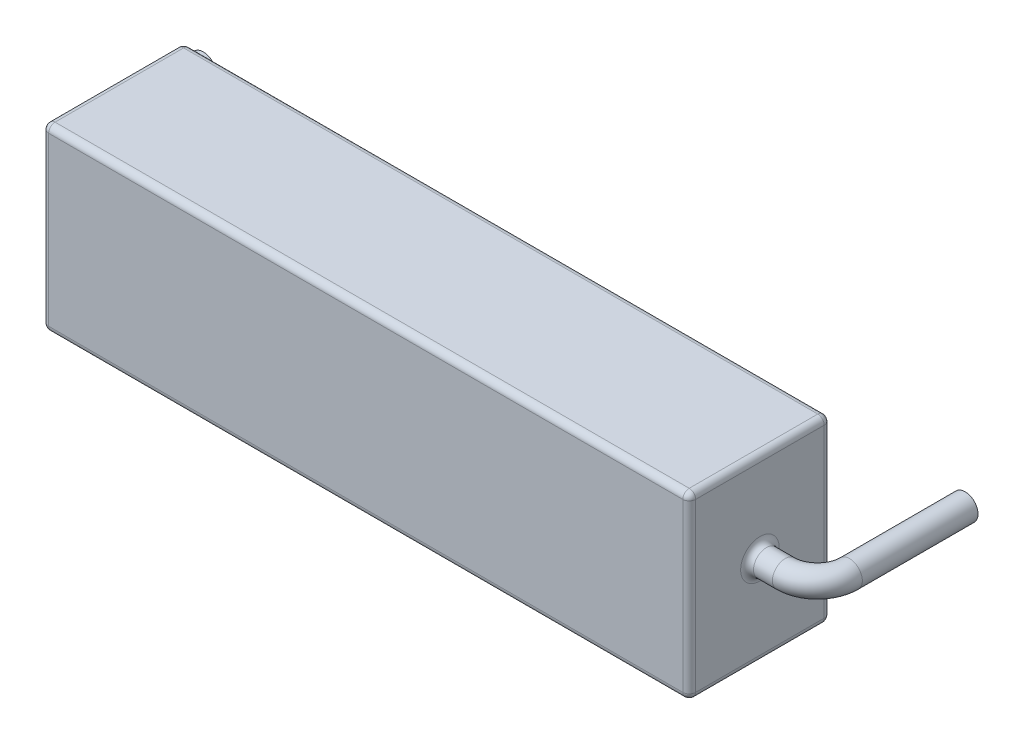
ISO-10303-21;
HEADER;
FILE_DESCRIPTION(('STEP AP214'),'2;1');
FILE_NAME('part.step','',(''),(''),'','','');
FILE_SCHEMA(('AUTOMOTIVE_DESIGN { 1 0 10303 214 1 1 1 1 }'));
ENDSEC;
DATA;
#1=APPLICATION_CONTEXT('core data for automotive mechanical design processes');
#2=APPLICATION_PROTOCOL_DEFINITION('international standard','automotive_design',2000,#1);
#3=PRODUCT_CONTEXT('',#1,'mechanical');
#4=PRODUCT('Part','Part','',(#3));
#5=PRODUCT_RELATED_PRODUCT_CATEGORY('part','',(#4));
#6=PRODUCT_DEFINITION_FORMATION('','',#4);
#7=PRODUCT_DEFINITION_CONTEXT('part definition',#1,'design');
#8=PRODUCT_DEFINITION('design','',#6,#7);
#9=PRODUCT_DEFINITION_SHAPE('','',#8);
#10=(LENGTH_UNIT() NAMED_UNIT(*) SI_UNIT(.MILLI.,.METRE.));
#11=(NAMED_UNIT(*) PLANE_ANGLE_UNIT() SI_UNIT($,.RADIAN.));
#12=(NAMED_UNIT(*) SI_UNIT($,.STERADIAN.) SOLID_ANGLE_UNIT());
#13=UNCERTAINTY_MEASURE_WITH_UNIT(LENGTH_MEASURE(1.E-05),#10,'distance_accuracy_value','');
#14=(GEOMETRIC_REPRESENTATION_CONTEXT(3) GLOBAL_UNCERTAINTY_ASSIGNED_CONTEXT((#13)) GLOBAL_UNIT_ASSIGNED_CONTEXT((#10,
#11,#12)) REPRESENTATION_CONTEXT('',''));
#15=CARTESIAN_POINT('',(0.,0.,0.));
#16=DIRECTION('',(0.,0.,1.));
#17=DIRECTION('',(1.,0.,0.));
#18=AXIS2_PLACEMENT_3D('',#15,#16,#17);
#19=CARTESIAN_POINT('',(0.,0.,3.3));
#20=DIRECTION('',(1.,0.,0.));
#21=DIRECTION('',(0.,0.,-1.));
#22=AXIS2_PLACEMENT_3D('',#19,#20,#21);
#23=PLANE('',#22);
#24=CARTESIAN_POINT('',(0.,2.1,1.65));
#25=DIRECTION('',(1.,0.,0.));
#26=DIRECTION('',(0.,0.,-1.));
#27=AXIS2_PLACEMENT_3D('',#24,#25,#26);
#28=CIRCLE('',#27,0.45);
#29=CARTESIAN_POINT('',(0.,2.1,1.2));
#30=VERTEX_POINT('',#29);
#31=EDGE_CURVE('E198',#30,#30,#28,.T.);
#32=ORIENTED_EDGE('',*,*,#31,.T.);
#33=EDGE_LOOP('',(#32));
#34=FACE_BOUND('',#33,.T.);
#35=DIRECTION('',(0.,0.,-1.));
#36=VECTOR('',#35,1.);
#37=CARTESIAN_POINT('',(0.,4.05,3.3));
#38=LINE('',#37,#36);
#39=CARTESIAN_POINT('',(0.,4.05,3.15));
#40=VERTEX_POINT('',#39);
#41=CARTESIAN_POINT('',(0.,4.05,0.15));
#42=VERTEX_POINT('',#41);
#43=EDGE_CURVE('E193',#40,#42,#38,.T.);
#44=ORIENTED_EDGE('',*,*,#43,.T.);
#45=DIRECTION('',(0.,-1.,0.));
#46=VECTOR('',#45,1.);
#47=CARTESIAN_POINT('',(0.,0.,0.15));
#48=LINE('',#47,#46);
#49=CARTESIAN_POINT('',(0.,0.15,0.15));
#50=VERTEX_POINT('',#49);
#51=EDGE_CURVE('E196',#42,#50,#48,.T.);
#52=ORIENTED_EDGE('',*,*,#51,.T.);
#53=DIRECTION('',(0.,0.,-1.));
#54=VECTOR('',#53,1.);
#55=CARTESIAN_POINT('',(0.,0.15,3.3));
#56=LINE('',#55,#54);
#57=CARTESIAN_POINT('',(0.,0.15,3.15));
#58=VERTEX_POINT('',#57);
#59=EDGE_CURVE('E191',#50,#58,#56,.F.);
#60=ORIENTED_EDGE('',*,*,#59,.T.);
#61=DIRECTION('',(0.,-1.,0.));
#62=VECTOR('',#61,1.);
#63=CARTESIAN_POINT('',(0.,0.,3.15));
#64=LINE('',#63,#62);
#65=EDGE_CURVE('E189',#58,#40,#64,.F.);
#66=ORIENTED_EDGE('',*,*,#65,.T.);
#67=EDGE_LOOP('',(#44,#52,#60,#66));
#68=FACE_BOUND('',#67,.T.);
#69=ADVANCED_FACE('F33',(#34,#68),#23,.F.);
#70=CARTESIAN_POINT('',(0.,0.,3.3));
#71=DIRECTION('',(0.,1.,0.));
#72=DIRECTION('',(0.,0.,1.));
#73=AXIS2_PLACEMENT_3D('',#70,#71,#72);
#74=PLANE('',#73);
#75=DIRECTION('',(0.,0.,-1.));
#76=VECTOR('',#75,1.);
#77=CARTESIAN_POINT('',(0.15,0.,3.3));
#78=LINE('',#77,#76);
#79=CARTESIAN_POINT('',(0.15,0.,3.15));
#80=VERTEX_POINT('',#79);
#81=CARTESIAN_POINT('',(0.15,0.,0.15));
#82=VERTEX_POINT('',#81);
#83=EDGE_CURVE('E172',#80,#82,#78,.T.);
#84=ORIENTED_EDGE('',*,*,#83,.T.);
#85=DIRECTION('',(1.,0.,0.));
#86=VECTOR('',#85,1.);
#87=CARTESIAN_POINT('',(15.1,0.,0.15));
#88=LINE('',#87,#86);
#89=CARTESIAN_POINT('',(14.95,0.,0.15));
#90=VERTEX_POINT('',#89);
#91=EDGE_CURVE('E177',#82,#90,#88,.T.);
#92=ORIENTED_EDGE('',*,*,#91,.T.);
#93=DIRECTION('',(0.,0.,-1.));
#94=VECTOR('',#93,1.);
#95=CARTESIAN_POINT('',(14.95,0.,3.3));
#96=LINE('',#95,#94);
#97=CARTESIAN_POINT('',(14.95,0.,3.15));
#98=VERTEX_POINT('',#97);
#99=EDGE_CURVE('E174',#90,#98,#96,.F.);
#100=ORIENTED_EDGE('',*,*,#99,.T.);
#101=DIRECTION('',(1.,0.,0.));
#102=VECTOR('',#101,1.);
#103=CARTESIAN_POINT('',(0.,0.,3.15));
#104=LINE('',#103,#102);
#105=EDGE_CURVE('E170',#98,#80,#104,.F.);
#106=ORIENTED_EDGE('',*,*,#105,.T.);
#107=EDGE_LOOP('',(#84,#92,#100,#106));
#108=FACE_BOUND('',#107,.T.);
#109=ADVANCED_FACE('F310',(#108),#74,.F.);
#110=CARTESIAN_POINT('',(15.1,0.,3.3));
#111=DIRECTION('',(-1.,0.,0.));
#112=DIRECTION('',(0.,0.,1.));
#113=AXIS2_PLACEMENT_3D('',#110,#111,#112);
#114=PLANE('',#113);
#115=CARTESIAN_POINT('',(15.1,2.1,1.65));
#116=DIRECTION('',(-1.,0.,0.));
#117=DIRECTION('',(0.,0.,1.));
#118=AXIS2_PLACEMENT_3D('',#115,#116,#117);
#119=CIRCLE('',#118,0.45);
#120=CARTESIAN_POINT('',(15.1,2.1,2.1));
#121=VERTEX_POINT('',#120);
#122=EDGE_CURVE('E167',#121,#121,#119,.T.);
#123=ORIENTED_EDGE('',*,*,#122,.T.);
#124=EDGE_LOOP('',(#123));
#125=FACE_BOUND('',#124,.T.);
#126=DIRECTION('',(0.,0.,-1.));
#127=VECTOR('',#126,1.);
#128=CARTESIAN_POINT('',(15.1,0.15,3.3));
#129=LINE('',#128,#127);
#130=CARTESIAN_POINT('',(15.1,0.15,3.15));
#131=VERTEX_POINT('',#130);
#132=CARTESIAN_POINT('',(15.1,0.15,0.15));
#133=VERTEX_POINT('',#132);
#134=EDGE_CURVE('E132',#131,#133,#129,.T.);
#135=ORIENTED_EDGE('',*,*,#134,.T.);
#136=DIRECTION('',(0.,1.,0.));
#137=VECTOR('',#136,1.);
#138=CARTESIAN_POINT('',(15.1,4.2,0.15));
#139=LINE('',#138,#137);
#140=CARTESIAN_POINT('',(15.1,4.05,0.15));
#141=VERTEX_POINT('',#140);
#142=EDGE_CURVE('E128',#133,#141,#139,.T.);
#143=ORIENTED_EDGE('',*,*,#142,.T.);
#144=DIRECTION('',(0.,0.,-1.));
#145=VECTOR('',#144,1.);
#146=CARTESIAN_POINT('',(15.1,4.05,3.3));
#147=LINE('',#146,#145);
#148=CARTESIAN_POINT('',(15.1,4.05,3.15));
#149=VERTEX_POINT('',#148);
#150=EDGE_CURVE('E120',#141,#149,#147,.F.);
#151=ORIENTED_EDGE('',*,*,#150,.T.);
#152=DIRECTION('',(0.,1.,0.));
#153=VECTOR('',#152,1.);
#154=CARTESIAN_POINT('',(15.1,0.,3.15));
#155=LINE('',#154,#153);
#156=EDGE_CURVE('E125',#149,#131,#155,.F.);
#157=ORIENTED_EDGE('',*,*,#156,.T.);
#158=EDGE_LOOP('',(#135,#143,#151,#157));
#159=FACE_BOUND('',#158,.T.);
#160=ADVANCED_FACE('F123',(#125,#159),#114,.F.);
#161=CARTESIAN_POINT('',(0.,4.2,3.3));
#162=DIRECTION('',(0.,-1.,0.));
#163=DIRECTION('',(0.,0.,-1.));
#164=AXIS2_PLACEMENT_3D('',#161,#162,#163);
#165=PLANE('',#164);
#166=DIRECTION('',(0.,0.,-1.));
#167=VECTOR('',#166,1.);
#168=CARTESIAN_POINT('',(14.95,4.2,3.3));
#169=LINE('',#168,#167);
#170=CARTESIAN_POINT('',(14.95,4.2,3.15));
#171=VERTEX_POINT('',#170);
#172=CARTESIAN_POINT('',(14.95,4.2,0.15));
#173=VERTEX_POINT('',#172);
#174=EDGE_CURVE('E140',#171,#173,#169,.T.);
#175=ORIENTED_EDGE('',*,*,#174,.T.);
#176=DIRECTION('',(-1.,0.,0.));
#177=VECTOR('',#176,1.);
#178=CARTESIAN_POINT('',(0.,4.2,0.15));
#179=LINE('',#178,#177);
#180=CARTESIAN_POINT('',(0.15,4.2,0.15));
#181=VERTEX_POINT('',#180);
#182=EDGE_CURVE('E184',#173,#181,#179,.T.);
#183=ORIENTED_EDGE('',*,*,#182,.T.);
#184=DIRECTION('',(0.,0.,-1.));
#185=VECTOR('',#184,1.);
#186=CARTESIAN_POINT('',(0.15,4.2,3.3));
#187=LINE('',#186,#185);
#188=CARTESIAN_POINT('',(0.15,4.2,3.15));
#189=VERTEX_POINT('',#188);
#190=EDGE_CURVE('E181',#181,#189,#187,.F.);
#191=ORIENTED_EDGE('',*,*,#190,.T.);
#192=DIRECTION('',(-1.,0.,0.));
#193=VECTOR('',#192,1.);
#194=CARTESIAN_POINT('',(0.,4.2,3.15));
#195=LINE('',#194,#193);
#196=EDGE_CURVE('E179',#189,#171,#195,.F.);
#197=ORIENTED_EDGE('',*,*,#196,.T.);
#198=EDGE_LOOP('',(#175,#183,#191,#197));
#199=FACE_BOUND('',#198,.T.);
#200=ADVANCED_FACE('F405',(#199),#165,.F.);
#201=CARTESIAN_POINT('',(0.,0.,3.3));
#202=DIRECTION('',(0.,0.,-1.));
#203=DIRECTION('',(-1.,0.,0.));
#204=AXIS2_PLACEMENT_3D('',#201,#202,#203);
#205=PLANE('',#204);
#206=DIRECTION('',(0.,1.,0.));
#207=VECTOR('',#206,1.);
#208=CARTESIAN_POINT('',(14.95,0.,3.3));
#209=LINE('',#208,#207);
#210=CARTESIAN_POINT('',(14.95,0.15,3.3));
#211=VERTEX_POINT('',#210);
#212=CARTESIAN_POINT('',(14.95,4.05,3.3));
#213=VERTEX_POINT('',#212);
#214=EDGE_CURVE('E42',#211,#213,#209,.T.);
#215=ORIENTED_EDGE('',*,*,#214,.T.);
#216=DIRECTION('',(-1.,0.,0.));
#217=VECTOR('',#216,1.);
#218=CARTESIAN_POINT('',(0.,4.05,3.3));
#219=LINE('',#218,#217);
#220=CARTESIAN_POINT('',(0.15,4.05,3.3));
#221=VERTEX_POINT('',#220);
#222=EDGE_CURVE('E11',#213,#221,#219,.T.);
#223=ORIENTED_EDGE('',*,*,#222,.T.);
#224=DIRECTION('',(0.,-1.,0.));
#225=VECTOR('',#224,1.);
#226=CARTESIAN_POINT('',(0.15,0.,3.3));
#227=LINE('',#226,#225);
#228=CARTESIAN_POINT('',(0.15,0.15,3.3));
#229=VERTEX_POINT('',#228);
#230=EDGE_CURVE('E213',#221,#229,#227,.T.);
#231=ORIENTED_EDGE('',*,*,#230,.T.);
#232=DIRECTION('',(1.,0.,0.));
#233=VECTOR('',#232,1.);
#234=CARTESIAN_POINT('',(0.,0.15,3.3));
#235=LINE('',#234,#233);
#236=EDGE_CURVE('E53',#229,#211,#235,.T.);
#237=ORIENTED_EDGE('',*,*,#236,.T.);
#238=EDGE_LOOP('',(#215,#223,#231,#237));
#239=FACE_BOUND('',#238,.T.);
#240=ADVANCED_FACE('F409',(#239),#205,.F.);
#241=CARTESIAN_POINT('',(0.,0.,0.));
#242=DIRECTION('',(0.,0.,-1.));
#243=DIRECTION('',(-1.,0.,0.));
#244=AXIS2_PLACEMENT_3D('',#241,#242,#243);
#245=PLANE('',#244);
#246=DIRECTION('',(0.,1.,0.));
#247=VECTOR('',#246,1.);
#248=CARTESIAN_POINT('',(14.95,0.,0.));
#249=LINE('',#248,#247);
#250=CARTESIAN_POINT('',(14.95,4.05,0.));
#251=VERTEX_POINT('',#250);
#252=CARTESIAN_POINT('',(14.95,0.15,0.));
#253=VERTEX_POINT('',#252);
#254=EDGE_CURVE('E208',#251,#253,#249,.F.);
#255=ORIENTED_EDGE('',*,*,#254,.T.);
#256=DIRECTION('',(1.,0.,0.));
#257=VECTOR('',#256,1.);
#258=CARTESIAN_POINT('',(0.,0.15,0.));
#259=LINE('',#258,#257);
#260=CARTESIAN_POINT('',(0.15,0.15,0.));
#261=VERTEX_POINT('',#260);
#262=EDGE_CURVE('E210',#253,#261,#259,.F.);
#263=ORIENTED_EDGE('',*,*,#262,.T.);
#264=DIRECTION('',(0.,-1.,0.));
#265=VECTOR('',#264,1.);
#266=CARTESIAN_POINT('',(0.15,4.2,0.));
#267=LINE('',#266,#265);
#268=CARTESIAN_POINT('',(0.15,4.05,0.));
#269=VERTEX_POINT('',#268);
#270=EDGE_CURVE('E204',#261,#269,#267,.F.);
#271=ORIENTED_EDGE('',*,*,#270,.T.);
#272=DIRECTION('',(-1.,0.,0.));
#273=VECTOR('',#272,1.);
#274=CARTESIAN_POINT('',(15.1,4.05,0.));
#275=LINE('',#274,#273);
#276=EDGE_CURVE('E206',#269,#251,#275,.F.);
#277=ORIENTED_EDGE('',*,*,#276,.T.);
#278=EDGE_LOOP('',(#255,#263,#271,#277));
#279=FACE_BOUND('',#278,.T.);
#280=ADVANCED_FACE('F413',(#279),#245,.T.);
#281=CARTESIAN_POINT('',(16.44,2.1,-1.8));
#282=DIRECTION('',(0.,0.,-1.));
#283=DIRECTION('',(-1.,0.,0.));
#284=AXIS2_PLACEMENT_3D('',#281,#282,#283);
#285=PLANE('',#284);
#286=CARTESIAN_POINT('',(16.44,2.1,-1.8));
#287=DIRECTION('',(0.,0.,-1.));
#288=DIRECTION('',(-1.,0.,0.));
#289=AXIS2_PLACEMENT_3D('',#286,#287,#288);
#290=CIRCLE('',#289,0.3);
#291=CARTESIAN_POINT('',(16.14,2.1,-1.79999999999999));
#292=VERTEX_POINT('',#291);
#293=EDGE_CURVE('E158',#292,#292,#290,.T.);
#294=ORIENTED_EDGE('',*,*,#293,.T.);
#295=EDGE_LOOP('',(#294));
#296=FACE_BOUND('',#295,.T.);
#297=ADVANCED_FACE('F307',(#296),#285,.T.);
#298=CARTESIAN_POINT('',(16.44,2.1,0.899999999999998));
#299=DIRECTION('',(0.,0.,-1.));
#300=DIRECTION('',(-1.,0.,0.));
#301=AXIS2_PLACEMENT_3D('',#298,#299,#300);
#302=CYLINDRICAL_SURFACE('',#301,0.3);
#303=CARTESIAN_POINT('',(16.44,2.1,0.899999999999998));
#304=DIRECTION('',(0.,0.,-1.));
#305=DIRECTION('',(-1.,0.,0.));
#306=AXIS2_PLACEMENT_3D('',#303,#304,#305);
#307=CIRCLE('',#306,0.3);
#308=CARTESIAN_POINT('',(16.74,2.1,0.899999999999997));
#309=VERTEX_POINT('',#308);
#310=EDGE_CURVE('E161',#309,#309,#307,.T.);
#311=ORIENTED_EDGE('',*,*,#310,.T.);
#312=EDGE_LOOP('',(#311));
#313=FACE_BOUND('',#312,.T.);
#314=ORIENTED_EDGE('',*,*,#293,.F.);
#315=EDGE_LOOP('',(#314));
#316=FACE_BOUND('',#315,.T.);
#317=ADVANCED_FACE('F292',(#313,#316),#302,.T.);
#318=CARTESIAN_POINT('',(15.69,2.1,0.9));
#319=DIRECTION('',(0.,1.,0.));
#320=DIRECTION('',(0.,0.,1.));
#321=AXIS2_PLACEMENT_3D('',#318,#319,#320);
#322=TOROIDAL_SURFACE('',#321,0.750000000000001,0.3);
#323=CARTESIAN_POINT('',(15.69,2.1,1.65));
#324=DIRECTION('',(1.,0.,0.));
#325=DIRECTION('',(0.,0.,-1.));
#326=AXIS2_PLACEMENT_3D('',#323,#324,#325);
#327=CIRCLE('',#326,0.3);
#328=CARTESIAN_POINT('',(15.69,2.1,1.95));
#329=VERTEX_POINT('',#328);
#330=EDGE_CURVE('E287',#329,#329,#327,.T.);
#331=CARTESIAN_POINT('',(15.69,2.1,0.9));
#332=DIRECTION('',(0.,1.,0.));
#333=DIRECTION('',(0.,0.,1.));
#334=AXIS2_PLACEMENT_3D('',#331,#332,#333);
#335=CIRCLE('',#334,1.05);
#336=EDGE_CURVE('',#329,#309,#335,.T.);
#337=ORIENTED_EDGE('',*,*,#330,.T.);
#338=ORIENTED_EDGE('',*,*,#310,.F.);
#339=ORIENTED_EDGE('',*,*,#336,.T.);
#340=ORIENTED_EDGE('',*,*,#336,.F.);
#341=EDGE_LOOP('',(#337,#339,#338,#340));
#342=FACE_BOUND('',#341,.T.);
#343=ADVANCED_FACE('F295',(#342),#322,.T.);
#344=CARTESIAN_POINT('',(-0.589999999999995,2.1,1.65));
#345=DIRECTION('',(1.,0.,0.));
#346=DIRECTION('',(0.,0.,-1.));
#347=AXIS2_PLACEMENT_3D('',#344,#345,#346);
#348=CYLINDRICAL_SURFACE('',#347,0.3);
#349=CARTESIAN_POINT('',(15.25,2.1,1.65));
#350=DIRECTION('',(-1.,0.,0.));
#351=DIRECTION('',(0.,0.,1.));
#352=AXIS2_PLACEMENT_3D('',#349,#350,#351);
#353=CIRCLE('',#352,0.3);
#354=CARTESIAN_POINT('',(15.25,2.1,1.95));
#355=VERTEX_POINT('',#354);
#356=EDGE_CURVE('E186',#355,#355,#353,.F.);
#357=ORIENTED_EDGE('',*,*,#356,.T.);
#358=EDGE_LOOP('',(#357));
#359=FACE_BOUND('',#358,.T.);
#360=ORIENTED_EDGE('',*,*,#330,.F.);
#361=EDGE_LOOP('',(#360));
#362=FACE_BOUND('',#361,.T.);
#363=ADVANCED_FACE('F297',(#359,#362),#348,.T.);
#364=CARTESIAN_POINT('',(-0.15,2.1,1.65));
#365=DIRECTION('',(1.,0.,0.));
#366=DIRECTION('',(0.,0.,-1.));
#367=AXIS2_PLACEMENT_3D('',#364,#365,#366);
#368=CIRCLE('',#367,0.3);
#369=CARTESIAN_POINT('',(-0.15,2.1,1.35));
#370=VERTEX_POINT('',#369);
#371=EDGE_CURVE('E201',#370,#370,#368,.F.);
#372=ORIENTED_EDGE('',*,*,#371,.T.);
#373=EDGE_LOOP('',(#372));
#374=FACE_BOUND('',#373,.T.);
#375=CARTESIAN_POINT('',(-0.589999999999995,2.1,1.65));
#376=DIRECTION('',(1.,0.,0.));
#377=DIRECTION('',(0.,0.,-1.));
#378=AXIS2_PLACEMENT_3D('',#375,#376,#377);
#379=CIRCLE('',#378,0.3);
#380=CARTESIAN_POINT('',(-0.589999999999992,2.1,1.95));
#381=VERTEX_POINT('',#380);
#382=EDGE_CURVE('E282',#381,#381,#379,.T.);
#383=ORIENTED_EDGE('',*,*,#382,.T.);
#384=EDGE_LOOP('',(#383));
#385=FACE_BOUND('',#384,.T.);
#386=ADVANCED_FACE('F304',(#374,#385),#348,.T.);
#387=CARTESIAN_POINT('',(-0.590000000000001,2.1,0.9));
#388=DIRECTION('',(0.,1.,0.));
#389=DIRECTION('',(0.,0.,1.));
#390=AXIS2_PLACEMENT_3D('',#387,#388,#389);
#391=TOROIDAL_SURFACE('',#390,0.75,0.3);
#392=CARTESIAN_POINT('',(-1.34,2.1,0.899999999999995));
#393=DIRECTION('',(0.,0.,1.));
#394=DIRECTION('',(1.,0.,0.));
#395=AXIS2_PLACEMENT_3D('',#392,#393,#394);
#396=CIRCLE('',#395,0.3);
#397=CARTESIAN_POINT('',(-1.64,2.1,0.899999999999994));
#398=VERTEX_POINT('',#397);
#399=EDGE_CURVE('E277',#398,#398,#396,.T.);
#400=CARTESIAN_POINT('',(-0.590000000000001,2.1,0.9));
#401=DIRECTION('',(0.,1.,0.));
#402=DIRECTION('',(0.,0.,1.));
#403=AXIS2_PLACEMENT_3D('',#400,#401,#402);
#404=CIRCLE('',#403,1.05);
#405=EDGE_CURVE('',#398,#381,#404,.T.);
#406=ORIENTED_EDGE('',*,*,#399,.T.);
#407=ORIENTED_EDGE('',*,*,#382,.F.);
#408=ORIENTED_EDGE('',*,*,#405,.T.);
#409=ORIENTED_EDGE('',*,*,#405,.F.);
#410=EDGE_LOOP('',(#406,#408,#407,#409));
#411=FACE_BOUND('',#410,.T.);
#412=ADVANCED_FACE('F448',(#411),#391,.T.);
#413=CARTESIAN_POINT('',(-1.34,2.1,0.899999999999995));
#414=DIRECTION('',(0.,0.,-1.));
#415=DIRECTION('',(-1.,0.,0.));
#416=AXIS2_PLACEMENT_3D('',#413,#414,#415);
#417=CYLINDRICAL_SURFACE('',#416,0.3);
#418=ORIENTED_EDGE('',*,*,#399,.F.);
#419=EDGE_LOOP('',(#418));
#420=FACE_BOUND('',#419,.T.);
#421=CARTESIAN_POINT('',(-1.34,2.1,-1.8));
#422=DIRECTION('',(0.,0.,1.));
#423=DIRECTION('',(1.,0.,0.));
#424=AXIS2_PLACEMENT_3D('',#421,#422,#423);
#425=CIRCLE('',#424,0.3);
#426=CARTESIAN_POINT('',(-1.04,2.1,-1.8));
#427=VERTEX_POINT('',#426);
#428=EDGE_CURVE('E271',#427,#427,#425,.T.);
#429=ORIENTED_EDGE('',*,*,#428,.T.);
#430=EDGE_LOOP('',(#429));
#431=FACE_BOUND('',#430,.T.);
#432=ADVANCED_FACE('F453',(#420,#431),#417,.T.);
#433=CARTESIAN_POINT('',(-1.34,2.1,-1.8));
#434=DIRECTION('',(0.,0.,1.));
#435=DIRECTION('',(1.,0.,0.));
#436=AXIS2_PLACEMENT_3D('',#433,#434,#435);
#437=PLANE('',#436);
#438=ORIENTED_EDGE('',*,*,#428,.F.);
#439=EDGE_LOOP('',(#438));
#440=FACE_BOUND('',#439,.T.);
#441=ADVANCED_FACE('F392',(#440),#437,.F.);
#442=CARTESIAN_POINT('',(0.15,4.05,3.3));
#443=DIRECTION('',(0.,0.,-1.));
#444=DIRECTION('',(-1.,0.,0.));
#445=AXIS2_PLACEMENT_3D('',#442,#443,#444);
#446=CYLINDRICAL_SURFACE('',#445,0.15);
#447=CARTESIAN_POINT('',(0.15,4.05,3.15));
#448=DIRECTION('',(0.,0.,1.));
#449=DIRECTION('',(1.,0.,0.));
#450=AXIS2_PLACEMENT_3D('',#447,#448,#449);
#451=CIRCLE('',#450,0.15);
#452=EDGE_CURVE('E37',#189,#40,#451,.T.);
#453=ORIENTED_EDGE('',*,*,#452,.F.);
#454=ORIENTED_EDGE('',*,*,#190,.F.);
#455=CARTESIAN_POINT('',(0.15,4.05,0.15));
#456=DIRECTION('',(0.,0.,-1.));
#457=DIRECTION('',(-1.,0.,0.));
#458=AXIS2_PLACEMENT_3D('',#455,#456,#457);
#459=CIRCLE('',#458,0.15);
#460=EDGE_CURVE('E264',#42,#181,#459,.T.);
#461=ORIENTED_EDGE('',*,*,#460,.F.);
#462=ORIENTED_EDGE('',*,*,#43,.F.);
#463=EDGE_LOOP('',(#453,#454,#461,#462));
#464=FACE_BOUND('',#463,.T.);
#465=ADVANCED_FACE('F390',(#464),#446,.T.);
#466=CARTESIAN_POINT('',(0.15,4.05,3.15));
#467=DIRECTION('',(0.,0.,1.));
#468=DIRECTION('',(1.,0.,0.));
#469=AXIS2_PLACEMENT_3D('',#466,#467,#468);
#470=SPHERICAL_SURFACE('',#469,0.15);
#471=CARTESIAN_POINT('',(0.15,4.05,3.15));
#472=DIRECTION('',(-1.,0.,0.));
#473=DIRECTION('',(0.,0.,1.));
#474=AXIS2_PLACEMENT_3D('',#471,#472,#473);
#475=CIRCLE('',#474,0.15);
#476=EDGE_CURVE('E259',#189,#221,#475,.F.);
#477=ORIENTED_EDGE('',*,*,#476,.F.);
#478=ORIENTED_EDGE('',*,*,#452,.T.);
#479=CARTESIAN_POINT('',(0.15,4.05,3.15));
#480=DIRECTION('',(0.,1.,0.));
#481=DIRECTION('',(0.,0.,1.));
#482=AXIS2_PLACEMENT_3D('',#479,#480,#481);
#483=CIRCLE('',#482,0.15);
#484=EDGE_CURVE('E262',#221,#40,#483,.F.);
#485=ORIENTED_EDGE('',*,*,#484,.F.);
#486=EDGE_LOOP('',(#477,#478,#485));
#487=FACE_BOUND('',#486,.T.);
#488=ADVANCED_FACE('F387',(#487),#470,.T.);
#489=CARTESIAN_POINT('',(0.15,4.05,0.15));
#490=DIRECTION('',(0.,0.,1.));
#491=DIRECTION('',(1.,0.,0.));
#492=AXIS2_PLACEMENT_3D('',#489,#490,#491);
#493=SPHERICAL_SURFACE('',#492,0.15);
#494=CARTESIAN_POINT('',(0.15,4.05,0.15));
#495=DIRECTION('',(0.,1.,0.));
#496=DIRECTION('',(0.,0.,1.));
#497=AXIS2_PLACEMENT_3D('',#494,#495,#496);
#498=CIRCLE('',#497,0.15);
#499=EDGE_CURVE('E253',#42,#269,#498,.F.);
#500=ORIENTED_EDGE('',*,*,#499,.F.);
#501=ORIENTED_EDGE('',*,*,#460,.T.);
#502=CARTESIAN_POINT('',(0.15,4.05,0.15));
#503=DIRECTION('',(-1.,0.,0.));
#504=DIRECTION('',(0.,0.,1.));
#505=AXIS2_PLACEMENT_3D('',#502,#503,#504);
#506=CIRCLE('',#505,0.15);
#507=EDGE_CURVE('E256',#269,#181,#506,.F.);
#508=ORIENTED_EDGE('',*,*,#507,.F.);
#509=EDGE_LOOP('',(#500,#501,#508));
#510=FACE_BOUND('',#509,.T.);
#511=ADVANCED_FACE('F383',(#510),#493,.T.);
#512=CARTESIAN_POINT('',(0.15,0.,3.15));
#513=DIRECTION('',(0.,-1.,0.));
#514=DIRECTION('',(0.,0.,-1.));
#515=AXIS2_PLACEMENT_3D('',#512,#513,#514);
#516=CYLINDRICAL_SURFACE('',#515,0.15);
#517=ORIENTED_EDGE('',*,*,#484,.T.);
#518=ORIENTED_EDGE('',*,*,#65,.F.);
#519=CARTESIAN_POINT('',(0.15,0.15,3.15));
#520=DIRECTION('',(0.,-1.,0.));
#521=DIRECTION('',(0.,0.,-1.));
#522=AXIS2_PLACEMENT_3D('',#519,#520,#521);
#523=CIRCLE('',#522,0.15);
#524=EDGE_CURVE('E247',#229,#58,#523,.T.);
#525=ORIENTED_EDGE('',*,*,#524,.F.);
#526=ORIENTED_EDGE('',*,*,#230,.F.);
#527=EDGE_LOOP('',(#517,#518,#525,#526));
#528=FACE_BOUND('',#527,.T.);
#529=ADVANCED_FACE('F379',(#528),#516,.T.);
#530=CARTESIAN_POINT('',(0.,4.05,3.15));
#531=DIRECTION('',(-1.,0.,0.));
#532=DIRECTION('',(0.,0.,1.));
#533=AXIS2_PLACEMENT_3D('',#530,#531,#532);
#534=CYLINDRICAL_SURFACE('',#533,0.15);
#535=ORIENTED_EDGE('',*,*,#476,.T.);
#536=ORIENTED_EDGE('',*,*,#222,.F.);
#537=CARTESIAN_POINT('',(14.95,4.05,3.15));
#538=DIRECTION('',(1.,0.,0.));
#539=DIRECTION('',(0.,0.,-1.));
#540=AXIS2_PLACEMENT_3D('',#537,#538,#539);
#541=CIRCLE('',#540,0.15);
#542=EDGE_CURVE('E144',#171,#213,#541,.T.);
#543=ORIENTED_EDGE('',*,*,#542,.F.);
#544=ORIENTED_EDGE('',*,*,#196,.F.);
#545=EDGE_LOOP('',(#535,#536,#543,#544));
#546=FACE_BOUND('',#545,.T.);
#547=ADVANCED_FACE('F376',(#546),#534,.T.);
#548=CARTESIAN_POINT('',(14.95,4.05,3.3));
#549=DIRECTION('',(0.,0.,-1.));
#550=DIRECTION('',(-1.,0.,0.));
#551=AXIS2_PLACEMENT_3D('',#548,#549,#550);
#552=CYLINDRICAL_SURFACE('',#551,0.15);
#553=CARTESIAN_POINT('',(14.95,4.05,0.15));
#554=DIRECTION('',(0.,0.,-1.));
#555=DIRECTION('',(-1.,0.,0.));
#556=AXIS2_PLACEMENT_3D('',#553,#554,#555);
#557=CIRCLE('',#556,0.15);
#558=EDGE_CURVE('E145',#173,#141,#557,.T.);
#559=ORIENTED_EDGE('',*,*,#558,.F.);
#560=ORIENTED_EDGE('',*,*,#174,.F.);
#561=CARTESIAN_POINT('',(14.95,4.05,3.15));
#562=DIRECTION('',(0.,0.,1.));
#563=DIRECTION('',(1.,0.,0.));
#564=AXIS2_PLACEMENT_3D('',#561,#562,#563);
#565=CIRCLE('',#564,0.15);
#566=EDGE_CURVE('E136',#149,#171,#565,.T.);
#567=ORIENTED_EDGE('',*,*,#566,.F.);
#568=ORIENTED_EDGE('',*,*,#150,.F.);
#569=EDGE_LOOP('',(#559,#560,#567,#568));
#570=FACE_BOUND('',#569,.T.);
#571=ADVANCED_FACE('F138',(#570),#552,.T.);
#572=CARTESIAN_POINT('',(0.,4.05,0.15));
#573=DIRECTION('',(1.,0.,0.));
#574=DIRECTION('',(0.,0.,-1.));
#575=AXIS2_PLACEMENT_3D('',#572,#573,#574);
#576=CYLINDRICAL_SURFACE('',#575,0.15);
#577=ORIENTED_EDGE('',*,*,#507,.T.);
#578=ORIENTED_EDGE('',*,*,#182,.F.);
#579=CARTESIAN_POINT('',(14.95,4.05,0.15));
#580=DIRECTION('',(1.,0.,0.));
#581=DIRECTION('',(0.,0.,-1.));
#582=AXIS2_PLACEMENT_3D('',#579,#580,#581);
#583=CIRCLE('',#582,0.15);
#584=EDGE_CURVE('E243',#251,#173,#583,.T.);
#585=ORIENTED_EDGE('',*,*,#584,.F.);
#586=ORIENTED_EDGE('',*,*,#276,.F.);
#587=EDGE_LOOP('',(#577,#578,#585,#586));
#588=FACE_BOUND('',#587,.T.);
#589=ADVANCED_FACE('F369',(#588),#576,.T.);
#590=CARTESIAN_POINT('',(0.15,0.,0.15));
#591=DIRECTION('',(0.,1.,0.));
#592=DIRECTION('',(0.,0.,1.));
#593=AXIS2_PLACEMENT_3D('',#590,#591,#592);
#594=CYLINDRICAL_SURFACE('',#593,0.15);
#595=ORIENTED_EDGE('',*,*,#499,.T.);
#596=ORIENTED_EDGE('',*,*,#270,.F.);
#597=CARTESIAN_POINT('',(0.15,0.15,0.15));
#598=DIRECTION('',(0.,-1.,0.));
#599=DIRECTION('',(0.,0.,-1.));
#600=AXIS2_PLACEMENT_3D('',#597,#598,#599);
#601=CIRCLE('',#600,0.15);
#602=EDGE_CURVE('E240',#50,#261,#601,.T.);
#603=ORIENTED_EDGE('',*,*,#602,.F.);
#604=ORIENTED_EDGE('',*,*,#51,.F.);
#605=EDGE_LOOP('',(#595,#596,#603,#604));
#606=FACE_BOUND('',#605,.T.);
#607=ADVANCED_FACE('F365',(#606),#594,.T.);
#608=CARTESIAN_POINT('',(0.15,0.15,3.3));
#609=DIRECTION('',(0.,0.,-1.));
#610=DIRECTION('',(-1.,0.,0.));
#611=AXIS2_PLACEMENT_3D('',#608,#609,#610);
#612=CYLINDRICAL_SURFACE('',#611,0.15);
#613=CARTESIAN_POINT('',(0.15,0.15,3.15));
#614=DIRECTION('',(0.,0.,1.));
#615=DIRECTION('',(1.,0.,0.));
#616=AXIS2_PLACEMENT_3D('',#613,#614,#615);
#617=CIRCLE('',#616,0.15);
#618=EDGE_CURVE('E250',#58,#80,#617,.T.);
#619=ORIENTED_EDGE('',*,*,#618,.F.);
#620=ORIENTED_EDGE('',*,*,#59,.F.);
#621=CARTESIAN_POINT('',(0.15,0.15,0.15));
#622=DIRECTION('',(0.,0.,-1.));
#623=DIRECTION('',(-1.,0.,0.));
#624=AXIS2_PLACEMENT_3D('',#621,#622,#623);
#625=CIRCLE('',#624,0.15);
#626=EDGE_CURVE('E237',#82,#50,#625,.T.);
#627=ORIENTED_EDGE('',*,*,#626,.F.);
#628=ORIENTED_EDGE('',*,*,#83,.F.);
#629=EDGE_LOOP('',(#619,#620,#627,#628));
#630=FACE_BOUND('',#629,.T.);
#631=ADVANCED_FACE('F361',(#630),#612,.T.);
#632=CARTESIAN_POINT('',(0.15,0.15,3.15));
#633=DIRECTION('',(0.,0.,1.));
#634=DIRECTION('',(1.,0.,0.));
#635=AXIS2_PLACEMENT_3D('',#632,#633,#634);
#636=SPHERICAL_SURFACE('',#635,0.15);
#637=ORIENTED_EDGE('',*,*,#524,.T.);
#638=ORIENTED_EDGE('',*,*,#618,.T.);
#639=CARTESIAN_POINT('',(0.15,0.15,3.15));
#640=DIRECTION('',(-1.,0.,0.));
#641=DIRECTION('',(0.,0.,1.));
#642=AXIS2_PLACEMENT_3D('',#639,#640,#641);
#643=CIRCLE('',#642,0.15);
#644=EDGE_CURVE('E151',#229,#80,#643,.F.);
#645=ORIENTED_EDGE('',*,*,#644,.F.);
#646=EDGE_LOOP('',(#637,#638,#645));
#647=FACE_BOUND('',#646,.T.);
#648=ADVANCED_FACE('F358',(#647),#636,.T.);
#649=CARTESIAN_POINT('',(14.95,4.05,3.15));
#650=DIRECTION('',(0.,0.,1.));
#651=DIRECTION('',(1.,0.,0.));
#652=AXIS2_PLACEMENT_3D('',#649,#650,#651);
#653=SPHERICAL_SURFACE('',#652,0.15);
#654=ORIENTED_EDGE('',*,*,#566,.T.);
#655=ORIENTED_EDGE('',*,*,#542,.T.);
#656=CARTESIAN_POINT('',(14.95,4.05,3.15));
#657=DIRECTION('',(0.,1.,0.));
#658=DIRECTION('',(0.,0.,1.));
#659=AXIS2_PLACEMENT_3D('',#656,#657,#658);
#660=CIRCLE('',#659,0.15);
#661=EDGE_CURVE('E148',#149,#213,#660,.F.);
#662=ORIENTED_EDGE('',*,*,#661,.F.);
#663=EDGE_LOOP('',(#654,#655,#662));
#664=FACE_BOUND('',#663,.T.);
#665=ADVANCED_FACE('F149',(#664),#653,.T.);
#666=CARTESIAN_POINT('',(14.95,4.05,0.15));
#667=DIRECTION('',(0.,0.,1.));
#668=DIRECTION('',(1.,0.,0.));
#669=AXIS2_PLACEMENT_3D('',#666,#667,#668);
#670=SPHERICAL_SURFACE('',#669,0.15);
#671=ORIENTED_EDGE('',*,*,#584,.T.);
#672=ORIENTED_EDGE('',*,*,#558,.T.);
#673=CARTESIAN_POINT('',(14.95,4.05,0.15));
#674=DIRECTION('',(0.,1.,0.));
#675=DIRECTION('',(0.,0.,1.));
#676=AXIS2_PLACEMENT_3D('',#673,#674,#675);
#677=CIRCLE('',#676,0.15);
#678=EDGE_CURVE('E152',#251,#141,#677,.F.);
#679=ORIENTED_EDGE('',*,*,#678,.F.);
#680=EDGE_LOOP('',(#671,#672,#679));
#681=FACE_BOUND('',#680,.T.);
#682=ADVANCED_FACE('F351',(#681),#670,.T.);
#683=CARTESIAN_POINT('',(0.15,0.15,0.15));
#684=DIRECTION('',(0.,0.,1.));
#685=DIRECTION('',(1.,0.,0.));
#686=AXIS2_PLACEMENT_3D('',#683,#684,#685);
#687=SPHERICAL_SURFACE('',#686,0.15);
#688=ORIENTED_EDGE('',*,*,#626,.T.);
#689=ORIENTED_EDGE('',*,*,#602,.T.);
#690=CARTESIAN_POINT('',(0.15,0.15,0.15));
#691=DIRECTION('',(-1.,0.,0.));
#692=DIRECTION('',(0.,0.,1.));
#693=AXIS2_PLACEMENT_3D('',#690,#691,#692);
#694=CIRCLE('',#693,0.15);
#695=EDGE_CURVE('E231',#82,#261,#694,.F.);
#696=ORIENTED_EDGE('',*,*,#695,.F.);
#697=EDGE_LOOP('',(#688,#689,#696));
#698=FACE_BOUND('',#697,.T.);
#699=ADVANCED_FACE('F347',(#698),#687,.T.);
#700=CARTESIAN_POINT('',(0.,0.15,3.15));
#701=DIRECTION('',(1.,0.,0.));
#702=DIRECTION('',(0.,0.,-1.));
#703=AXIS2_PLACEMENT_3D('',#700,#701,#702);
#704=CYLINDRICAL_SURFACE('',#703,0.15);
#705=ORIENTED_EDGE('',*,*,#644,.T.);
#706=ORIENTED_EDGE('',*,*,#105,.F.);
#707=CARTESIAN_POINT('',(14.95,0.15,3.15));
#708=DIRECTION('',(1.,0.,0.));
#709=DIRECTION('',(0.,0.,-1.));
#710=AXIS2_PLACEMENT_3D('',#707,#708,#709);
#711=CIRCLE('',#710,0.15);
#712=EDGE_CURVE('E228',#211,#98,#711,.T.);
#713=ORIENTED_EDGE('',*,*,#712,.F.);
#714=ORIENTED_EDGE('',*,*,#236,.F.);
#715=EDGE_LOOP('',(#705,#706,#713,#714));
#716=FACE_BOUND('',#715,.T.);
#717=ADVANCED_FACE('F344',(#716),#704,.T.);
#718=CARTESIAN_POINT('',(14.95,0.,3.15));
#719=DIRECTION('',(0.,1.,0.));
#720=DIRECTION('',(0.,0.,1.));
#721=AXIS2_PLACEMENT_3D('',#718,#719,#720);
#722=CYLINDRICAL_SURFACE('',#721,0.15);
#723=ORIENTED_EDGE('',*,*,#661,.T.);
#724=ORIENTED_EDGE('',*,*,#214,.F.);
#725=CARTESIAN_POINT('',(14.95,0.15,3.15));
#726=DIRECTION('',(0.,-1.,0.));
#727=DIRECTION('',(0.,0.,-1.));
#728=AXIS2_PLACEMENT_3D('',#725,#726,#727);
#729=CIRCLE('',#728,0.15);
#730=EDGE_CURVE('E156',#131,#211,#729,.T.);
#731=ORIENTED_EDGE('',*,*,#730,.F.);
#732=ORIENTED_EDGE('',*,*,#156,.F.);
#733=EDGE_LOOP('',(#723,#724,#731,#732));
#734=FACE_BOUND('',#733,.T.);
#735=ADVANCED_FACE('F154',(#734),#722,.T.);
#736=CARTESIAN_POINT('',(14.95,0.,0.15));
#737=DIRECTION('',(0.,-1.,0.));
#738=DIRECTION('',(0.,0.,-1.));
#739=AXIS2_PLACEMENT_3D('',#736,#737,#738);
#740=CYLINDRICAL_SURFACE('',#739,0.15);
#741=ORIENTED_EDGE('',*,*,#678,.T.);
#742=ORIENTED_EDGE('',*,*,#142,.F.);
#743=CARTESIAN_POINT('',(14.95,0.15,0.15));
#744=DIRECTION('',(0.,-1.,0.));
#745=DIRECTION('',(0.,0.,-1.));
#746=AXIS2_PLACEMENT_3D('',#743,#744,#745);
#747=CIRCLE('',#746,0.15);
#748=EDGE_CURVE('E224',#253,#133,#747,.T.);
#749=ORIENTED_EDGE('',*,*,#748,.F.);
#750=ORIENTED_EDGE('',*,*,#254,.F.);
#751=EDGE_LOOP('',(#741,#742,#749,#750));
#752=FACE_BOUND('',#751,.T.);
#753=ADVANCED_FACE('F337',(#752),#740,.T.);
#754=CARTESIAN_POINT('',(0.,0.15,0.15));
#755=DIRECTION('',(-1.,0.,0.));
#756=DIRECTION('',(0.,0.,1.));
#757=AXIS2_PLACEMENT_3D('',#754,#755,#756);
#758=CYLINDRICAL_SURFACE('',#757,0.15);
#759=ORIENTED_EDGE('',*,*,#695,.T.);
#760=ORIENTED_EDGE('',*,*,#262,.F.);
#761=CARTESIAN_POINT('',(14.95,0.15,0.15));
#762=DIRECTION('',(1.,0.,0.));
#763=DIRECTION('',(0.,0.,-1.));
#764=AXIS2_PLACEMENT_3D('',#761,#762,#763);
#765=CIRCLE('',#764,0.15);
#766=EDGE_CURVE('E221',#90,#253,#765,.T.);
#767=ORIENTED_EDGE('',*,*,#766,.F.);
#768=ORIENTED_EDGE('',*,*,#91,.F.);
#769=EDGE_LOOP('',(#759,#760,#767,#768));
#770=FACE_BOUND('',#769,.T.);
#771=ADVANCED_FACE('F333',(#770),#758,.T.);
#772=CARTESIAN_POINT('',(14.95,0.15,3.15));
#773=DIRECTION('',(0.,0.,1.));
#774=DIRECTION('',(1.,0.,0.));
#775=AXIS2_PLACEMENT_3D('',#772,#773,#774);
#776=SPHERICAL_SURFACE('',#775,0.15);
#777=ORIENTED_EDGE('',*,*,#730,.T.);
#778=ORIENTED_EDGE('',*,*,#712,.T.);
#779=CARTESIAN_POINT('',(14.95,0.15,3.15));
#780=DIRECTION('',(0.,0.,1.));
#781=DIRECTION('',(1.,0.,0.));
#782=AXIS2_PLACEMENT_3D('',#779,#780,#781);
#783=CIRCLE('',#782,0.15);
#784=EDGE_CURVE('E219',#131,#98,#783,.F.);
#785=ORIENTED_EDGE('',*,*,#784,.F.);
#786=EDGE_LOOP('',(#777,#778,#785));
#787=FACE_BOUND('',#786,.T.);
#788=ADVANCED_FACE('F329',(#787),#776,.T.);
#789=CARTESIAN_POINT('',(14.95,0.15,0.15));
#790=DIRECTION('',(0.,0.,1.));
#791=DIRECTION('',(1.,0.,0.));
#792=AXIS2_PLACEMENT_3D('',#789,#790,#791);
#793=SPHERICAL_SURFACE('',#792,0.15);
#794=ORIENTED_EDGE('',*,*,#766,.T.);
#795=ORIENTED_EDGE('',*,*,#748,.T.);
#796=CARTESIAN_POINT('',(14.95,0.15,0.15));
#797=DIRECTION('',(0.,0.,-1.));
#798=DIRECTION('',(-1.,0.,0.));
#799=AXIS2_PLACEMENT_3D('',#796,#797,#798);
#800=CIRCLE('',#799,0.15);
#801=EDGE_CURVE('E217',#90,#133,#800,.F.);
#802=ORIENTED_EDGE('',*,*,#801,.F.);
#803=EDGE_LOOP('',(#794,#795,#802));
#804=FACE_BOUND('',#803,.T.);
#805=ADVANCED_FACE('F325',(#804),#793,.T.);
#806=CARTESIAN_POINT('',(14.95,0.15,3.3));
#807=DIRECTION('',(0.,0.,-1.));
#808=DIRECTION('',(-1.,0.,0.));
#809=AXIS2_PLACEMENT_3D('',#806,#807,#808);
#810=CYLINDRICAL_SURFACE('',#809,0.15);
#811=ORIENTED_EDGE('',*,*,#784,.T.);
#812=ORIENTED_EDGE('',*,*,#99,.F.);
#813=ORIENTED_EDGE('',*,*,#801,.T.);
#814=ORIENTED_EDGE('',*,*,#134,.F.);
#815=EDGE_LOOP('',(#811,#812,#813,#814));
#816=FACE_BOUND('',#815,.T.);
#817=ADVANCED_FACE('F321',(#816),#810,.T.);
#818=CARTESIAN_POINT('',(15.25,2.1,1.65));
#819=DIRECTION('',(-1.,0.,0.));
#820=DIRECTION('',(0.,0.,1.));
#821=AXIS2_PLACEMENT_3D('',#818,#819,#820);
#822=TOROIDAL_SURFACE('',#821,0.45,0.15);
#823=ORIENTED_EDGE('',*,*,#356,.F.);
#824=EDGE_LOOP('',(#823));
#825=FACE_BOUND('',#824,.T.);
#826=ORIENTED_EDGE('',*,*,#122,.F.);
#827=EDGE_LOOP('',(#826));
#828=FACE_BOUND('',#827,.T.);
#829=ADVANCED_FACE('F324',(#825,#828),#822,.F.);
#830=CARTESIAN_POINT('',(-0.15,2.1,1.65));
#831=DIRECTION('',(1.,0.,0.));
#832=DIRECTION('',(0.,0.,-1.));
#833=AXIS2_PLACEMENT_3D('',#830,#831,#832);
#834=TOROIDAL_SURFACE('',#833,0.45,0.15);
#835=ORIENTED_EDGE('',*,*,#371,.F.);
#836=EDGE_LOOP('',(#835));
#837=FACE_BOUND('',#836,.T.);
#838=ORIENTED_EDGE('',*,*,#31,.F.);
#839=EDGE_LOOP('',(#838));
#840=FACE_BOUND('',#839,.T.);
#841=ADVANCED_FACE('F35',(#837,#840),#834,.F.);
#842=CLOSED_SHELL('',(#69,#109,#160,#200,#240,#280,#297,#317,#343,#363,#386,#412,#432,#441,#465,
#488,#511,#529,#547,#571,#589,#607,#631,#648,#665,#682,#699,#717,#735,#753,#771,#788,#805,#817,
#829,#841));
#843=MANIFOLD_SOLID_BREP('B2',#842);
#844=ADVANCED_BREP_SHAPE_REPRESENTATION('',(#18,#843),#14);
#845=SHAPE_DEFINITION_REPRESENTATION(#9,#844);
ENDSEC;
END-ISO-10303-21;
